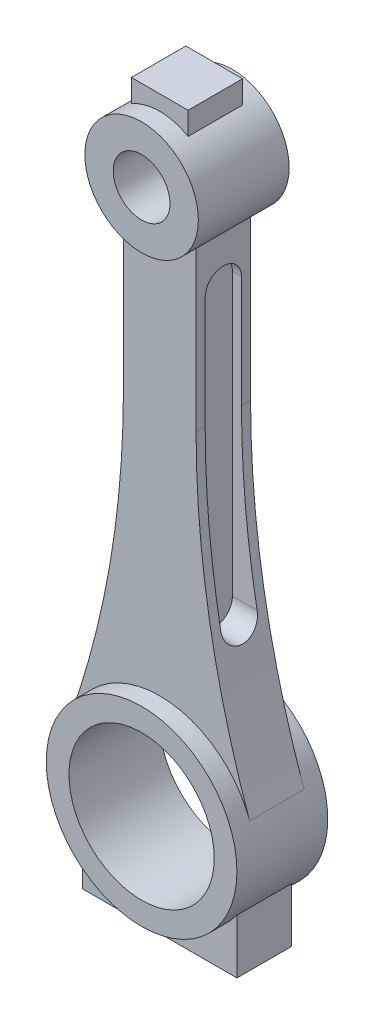
ISO-10303-21;
HEADER;
FILE_DESCRIPTION(('STEP AP214'),'2;1');
FILE_NAME('part.step','',(''),(''),'','','');
FILE_SCHEMA(('AUTOMOTIVE_DESIGN { 1 0 10303 214 1 1 1 1 }'));
ENDSEC;
DATA;
#1=APPLICATION_CONTEXT('core data for automotive mechanical design processes');
#2=APPLICATION_PROTOCOL_DEFINITION('international standard','automotive_design',2000,#1);
#3=PRODUCT_CONTEXT('',#1,'mechanical');
#4=PRODUCT('Part','Part','',(#3));
#5=PRODUCT_RELATED_PRODUCT_CATEGORY('part','',(#4));
#6=PRODUCT_DEFINITION_FORMATION('','',#4);
#7=PRODUCT_DEFINITION_CONTEXT('part definition',#1,'design');
#8=PRODUCT_DEFINITION('design','',#6,#7);
#9=PRODUCT_DEFINITION_SHAPE('','',#8);
#10=(LENGTH_UNIT() NAMED_UNIT(*) SI_UNIT(.MILLI.,.METRE.));
#11=(NAMED_UNIT(*) PLANE_ANGLE_UNIT() SI_UNIT($,.RADIAN.));
#12=(NAMED_UNIT(*) SI_UNIT($,.STERADIAN.) SOLID_ANGLE_UNIT());
#13=UNCERTAINTY_MEASURE_WITH_UNIT(LENGTH_MEASURE(1.E-05),#10,'distance_accuracy_value','');
#14=(GEOMETRIC_REPRESENTATION_CONTEXT(3) GLOBAL_UNCERTAINTY_ASSIGNED_CONTEXT((#13)) GLOBAL_UNIT_ASSIGNED_CONTEXT((#10,
#11,#12)) REPRESENTATION_CONTEXT('',''));
#15=CARTESIAN_POINT('',(0.,0.,0.));
#16=DIRECTION('',(0.,0.,1.));
#17=DIRECTION('',(1.,0.,0.));
#18=AXIS2_PLACEMENT_3D('',#15,#16,#17);
#19=CARTESIAN_POINT('',(212.132819979024,75.3953136438508,6.));
#20=DIRECTION('',(0.,0.,-1.));
#21=DIRECTION('',(-1.,0.,0.));
#22=AXIS2_PLACEMENT_3D('',#19,#20,#21);
#23=CYLINDRICAL_SURFACE('',#22,204.132819979024);
#24=CARTESIAN_POINT('',(11.4544735884215,38.,-4.00000000000001));
#25=CARTESIAN_POINT('',(11.4757515518411,37.8858086335559,-4.00000967356236));
#26=CARTESIAN_POINT('',(11.4971278489319,37.7716411229783,-3.9951101211208));
#27=CARTESIAN_POINT('',(11.5399210356049,37.544152772884,-3.97557755361704));
#28=CARTESIAN_POINT('',(11.5613379239584,37.4308319082382,-3.9609448286138));
#29=CARTESIAN_POINT('',(11.6040518019029,37.2058589467753,-3.92203609087538));
#30=CARTESIAN_POINT('',(11.6253488219802,37.0942064124742,-3.89776265395078));
#31=CARTESIAN_POINT('',(11.6676599337569,36.8733657612217,-3.83975872762631));
#32=CARTESIAN_POINT('',(11.6886740293759,36.7641776101131,-3.80602836938937));
#33=CARTESIAN_POINT('',(11.7510730473326,36.4413470108117,-3.69089420326938));
#34=CARTESIAN_POINT('',(11.7918289081029,36.2323636826891,-3.59553432969808));
#35=CARTESIAN_POINT('',(11.8702126062764,35.833491871712,-3.37027556179514));
#36=CARTESIAN_POINT('',(11.9078413597511,35.643597793309,-3.24038682968163));
#37=CARTESIAN_POINT('',(11.9784728244352,35.2894796680367,-2.950436910244));
#38=CARTESIAN_POINT('',(12.0115036519544,35.1250988255321,-2.79057453802655));
#39=CARTESIAN_POINT('',(12.0720036427705,34.8256035029566,-2.44449926104124));
#40=CARTESIAN_POINT('',(12.0994724370193,34.6904909648341,-2.25828460915734));
#41=CARTESIAN_POINT('',(12.1473413477104,34.4559602912754,-1.86832249559897));
#42=CARTESIAN_POINT('',(12.1678582991114,34.3559510460777,-1.66494499104501));
#43=CARTESIAN_POINT('',(12.201667760202,34.1915558050773,-1.24372237948288));
#44=CARTESIAN_POINT('',(12.2149615713728,34.1271633917176,-1.02587988675161));
#45=CARTESIAN_POINT('',(12.2336033492388,34.0369591960168,-0.586274812122711));
#46=CARTESIAN_POINT('',(12.2390950212481,34.0104496060439,-0.364661335561861));
#47=CARTESIAN_POINT('',(12.2423732155318,33.9946184843632,0.0799443502249359));
#48=CARTESIAN_POINT('',(12.2401601145853,34.0052951341723,0.302936491499029));
#49=CARTESIAN_POINT('',(12.2281765408432,34.0632127244266,0.741781925824308));
#50=CARTESIAN_POINT('',(12.2184766498272,34.1101121767816,0.957682365575695));
#51=CARTESIAN_POINT('',(12.1919895794175,34.2385791029979,1.37844153266757));
#52=CARTESIAN_POINT('',(12.1752023313576,34.3201469127454,1.58330015300714));
#53=CARTESIAN_POINT('',(12.1350793834177,34.5159552856904,1.977397761575));
#54=CARTESIAN_POINT('',(12.1117098081663,34.6303649264094,2.16654921549123));
#55=CARTESIAN_POINT('',(12.0593260749273,34.8882465100265,2.52297125984127));
#56=CARTESIAN_POINT('',(12.0303117725959,35.0317191961119,2.69024129055298));
#57=CARTESIAN_POINT('',(11.9671383735568,35.3461665633751,3.00114206510913));
#58=CARTESIAN_POINT('',(11.9329025496515,35.5175545383741,3.14433904981938));
#59=CARTESIAN_POINT('',(11.8607975408037,35.8812712267655,3.40006280722764));
#60=CARTESIAN_POINT('',(11.8229268395298,36.0736086840292,3.51257670427656));
#61=CARTESIAN_POINT('',(11.744011046999,36.4777513253325,3.70593438635491));
#62=CARTESIAN_POINT('',(11.7029182624971,36.6898643551292,3.78611370956408));
#63=CARTESIAN_POINT('',(11.6195357198389,37.1241795414682,3.90944320644274));
#64=CARTESIAN_POINT('',(11.5772477716993,37.3463667203578,3.95264656840454));
#65=CARTESIAN_POINT('',(11.5215540274852,37.6417241762258,3.98457340087694));
#66=CARTESIAN_POINT('',(11.5080944382148,37.713314753212,3.99036111817268));
#67=CARTESIAN_POINT('',(11.481236818834,37.8565916807733,3.99806924003837));
#68=CARTESIAN_POINT('',(11.4678387235409,37.9282776734255,3.99999606757804));
#69=CARTESIAN_POINT('',(11.4544735884215,38.,3.99999999999999));
#70=B_SPLINE_CURVE_WITH_KNOTS('',3,(#24,#25,#26,#27,#28,#29,#30,#31,#32,#33,#34,#35,#36,#37,#38,
#39,#40,#41,#42,#43,#44,#45,#46,#47,#48,#49,#50,#51,#52,#53,#54,#55,#56,#57,#58,#59,#60,#61,#62,
#63,#64,#65,#66,#67,#68,#69),.UNSPECIFIED.,.F.,.F.,(4,2,2,2,2,2,2,2,2,2,2,2,2,2,2,2,2,2,2,2,2,2,
4),(0.,0.348357600629769,0.696704820295746,1.044959030908,1.39320841164154,2.0894785742732,
2.78554404346983,3.47714614167072,4.16879411353829,4.84816302804555,5.52740949173435,
6.19397531687088,6.86050854603355,7.52083364695974,8.18116514562693,8.84495910470897,
9.508770040179,10.1834922182609,10.8584970981523,11.546741507572,12.2339942357505,
12.4531452672714,12.6719314158043),.UNSPECIFIED.);
#71=CARTESIAN_POINT('',(11.4544735884215,38.,-4.00000000000001));
#72=VERTEX_POINT('',#71);
#73=CARTESIAN_POINT('',(11.4544735884215,38.,3.99999999999999));
#74=VERTEX_POINT('',#73);
#75=EDGE_CURVE('E483',#72,#74,#70,.T.);
#76=ORIENTED_EDGE('',*,*,#75,.T.);
#77=CARTESIAN_POINT('',(212.132819979024,75.3953136438508,4.));
#78=DIRECTION('',(0.,0.,-1.));
#79=DIRECTION('',(0.,1.,0.));
#80=AXIS2_PLACEMENT_3D('',#77,#78,#79);
#81=CIRCLE('',#80,204.132819979024);
#82=CARTESIAN_POINT('',(8.00000000000001,75.3953136438507,4.));
#83=VERTEX_POINT('',#82);
#84=EDGE_CURVE('E280',#74,#83,#81,.T.);
#85=ORIENTED_EDGE('',*,*,#84,.T.);
#86=DIRECTION('',(0.,0.,-1.));
#87=VECTOR('',#86,1.);
#88=CARTESIAN_POINT('',(8.00000000000001,75.3953136438507,6.));
#89=LINE('',#88,#87);
#90=CARTESIAN_POINT('',(8.00000000000001,75.3953136438507,6.));
#91=VERTEX_POINT('',#90);
#92=EDGE_CURVE('E438',#91,#83,#89,.T.);
#93=ORIENTED_EDGE('',*,*,#92,.F.);
#94=CARTESIAN_POINT('',(212.132819979024,75.3953136438508,6.));
#95=DIRECTION('',(0.,0.,1.));
#96=DIRECTION('',(1.,0.,0.));
#97=AXIS2_PLACEMENT_3D('',#94,#95,#96);
#98=CIRCLE('',#97,204.132819979024);
#99=CARTESIAN_POINT('',(19.7873824881444,7.03274443356765,6.));
#100=VERTEX_POINT('',#99);
#101=EDGE_CURVE('E404',#91,#100,#98,.T.);
#102=ORIENTED_EDGE('',*,*,#101,.T.);
#103=DIRECTION('',(0.,0.,-1.));
#104=VECTOR('',#103,1.);
#105=CARTESIAN_POINT('',(19.7873824881444,7.03274443356765,6.));
#106=LINE('',#105,#104);
#107=CARTESIAN_POINT('',(19.7873824881444,7.03274443356765,-6.));
#108=VERTEX_POINT('',#107);
#109=EDGE_CURVE('E442',#100,#108,#106,.T.);
#110=ORIENTED_EDGE('',*,*,#109,.T.);
#111=CARTESIAN_POINT('',(212.132819979024,75.3953136438508,-6.));
#112=DIRECTION('',(0.,0.,1.));
#113=DIRECTION('',(1.,0.,0.));
#114=AXIS2_PLACEMENT_3D('',#111,#112,#113);
#115=CIRCLE('',#114,204.132819979024);
#116=CARTESIAN_POINT('',(8.00000000000001,75.3953136438507,-6.));
#117=VERTEX_POINT('',#116);
#118=EDGE_CURVE('E428',#117,#108,#115,.T.);
#119=ORIENTED_EDGE('',*,*,#118,.F.);
#120=CARTESIAN_POINT('',(8.00000000000001,75.3953136438507,-4.));
#121=VERTEX_POINT('',#120);
#122=EDGE_CURVE('E437',#121,#117,#89,.T.);
#123=ORIENTED_EDGE('',*,*,#122,.F.);
#124=CARTESIAN_POINT('',(212.132819979024,75.3953136438508,-4.));
#125=DIRECTION('',(0.,0.,1.));
#126=DIRECTION('',(0.,-1.,0.));
#127=AXIS2_PLACEMENT_3D('',#124,#125,#126);
#128=CIRCLE('',#127,204.132819979024);
#129=EDGE_CURVE('E69',#121,#72,#128,.T.);
#130=ORIENTED_EDGE('',*,*,#129,.T.);
#131=EDGE_LOOP('',(#76,#85,#93,#102,#110,#119,#123,#130));
#132=FACE_BOUND('',#131,.T.);
#133=ADVANCED_FACE('F45',(#132),#23,.F.);
#134=CARTESIAN_POINT('',(8.00000000000003,0.,6.));
#135=DIRECTION('',(-1.,0.,0.));
#136=DIRECTION('',(0.,-1.,0.));
#137=AXIS2_PLACEMENT_3D('',#134,#135,#136);
#138=PLANE('',#137);
#139=DIRECTION('',(0.,-1.,0.));
#140=VECTOR('',#139,1.);
#141=CARTESIAN_POINT('',(8.00000000000003,0.,3.99999999999999));
#142=LINE('',#141,#140);
#143=CARTESIAN_POINT('',(8.00000000000001,100.,4.));
#144=VERTEX_POINT('',#143);
#145=EDGE_CURVE('E480',#144,#83,#142,.T.);
#146=ORIENTED_EDGE('',*,*,#145,.F.);
#147=CARTESIAN_POINT('',(8.,100.,0.));
#148=DIRECTION('',(-1.,0.,0.));
#149=DIRECTION('',(0.,-1.,0.));
#150=AXIS2_PLACEMENT_3D('',#147,#148,#149);
#151=CIRCLE('',#150,4.);
#152=CARTESIAN_POINT('',(8.00000000000001,100.,-4.));
#153=VERTEX_POINT('',#152);
#154=EDGE_CURVE('E477',#153,#144,#151,.F.);
#155=ORIENTED_EDGE('',*,*,#154,.F.);
#156=DIRECTION('',(0.,1.,0.));
#157=VECTOR('',#156,1.);
#158=CARTESIAN_POINT('',(8.00000000000003,0.,-4.00000000000001));
#159=LINE('',#158,#157);
#160=EDGE_CURVE('E468',#121,#153,#159,.T.);
#161=ORIENTED_EDGE('',*,*,#160,.F.);
#162=ORIENTED_EDGE('',*,*,#122,.T.);
#163=DIRECTION('',(0.,1.,0.));
#164=VECTOR('',#163,1.);
#165=CARTESIAN_POINT('',(8.00000000000003,0.,-6.));
#166=LINE('',#165,#164);
#167=CARTESIAN_POINT('',(8.,110.395313643851,-6.));
#168=VERTEX_POINT('',#167);
#169=EDGE_CURVE('E393',#117,#168,#166,.T.);
#170=ORIENTED_EDGE('',*,*,#169,.T.);
#171=DIRECTION('',(0.,0.,-1.));
#172=VECTOR('',#171,1.);
#173=CARTESIAN_POINT('',(8.,110.395313643851,6.));
#174=LINE('',#173,#172);
#175=CARTESIAN_POINT('',(8.,110.395313643851,6.));
#176=VERTEX_POINT('',#175);
#177=EDGE_CURVE('E412',#176,#168,#174,.T.);
#178=ORIENTED_EDGE('',*,*,#177,.F.);
#179=DIRECTION('',(0.,1.,0.));
#180=VECTOR('',#179,1.);
#181=CARTESIAN_POINT('',(8.00000000000003,0.,6.));
#182=LINE('',#181,#180);
#183=EDGE_CURVE('E408',#91,#176,#182,.T.);
#184=ORIENTED_EDGE('',*,*,#183,.F.);
#185=ORIENTED_EDGE('',*,*,#92,.T.);
#186=EDGE_LOOP('',(#146,#155,#161,#162,#170,#178,#184,#185));
#187=FACE_BOUND('',#186,.T.);
#188=ADVANCED_FACE('F578',(#187),#138,.F.);
#189=CARTESIAN_POINT('',(0.,120.,10.));
#190=DIRECTION('',(0.,0.,-1.));
#191=DIRECTION('',(-1.,0.,0.));
#192=AXIS2_PLACEMENT_3D('',#189,#190,#191);
#193=CYLINDRICAL_SURFACE('',#192,6.25);
#194=CARTESIAN_POINT('',(0.,120.,10.));
#195=DIRECTION('',(0.,0.,1.));
#196=DIRECTION('',(1.,0.,0.));
#197=AXIS2_PLACEMENT_3D('',#194,#195,#196);
#198=CIRCLE('',#197,6.25);
#199=CARTESIAN_POINT('',(6.25,120.,10.));
#200=VERTEX_POINT('',#199);
#201=EDGE_CURVE('E459',#200,#200,#198,.T.);
#202=ORIENTED_EDGE('',*,*,#201,.T.);
#203=EDGE_LOOP('',(#202));
#204=FACE_BOUND('',#203,.T.);
#205=CARTESIAN_POINT('',(0.,120.,-10.));
#206=DIRECTION('',(0.,0.,1.));
#207=DIRECTION('',(1.,0.,0.));
#208=AXIS2_PLACEMENT_3D('',#205,#206,#207);
#209=CIRCLE('',#208,6.25);
#210=CARTESIAN_POINT('',(6.25,120.,-10.));
#211=VERTEX_POINT('',#210);
#212=EDGE_CURVE('E458',#211,#211,#209,.T.);
#213=ORIENTED_EDGE('',*,*,#212,.F.);
#214=EDGE_LOOP('',(#213));
#215=FACE_BOUND('',#214,.T.);
#216=ADVANCED_FACE('F47',(#204,#215),#193,.F.);
#217=CARTESIAN_POINT('',(0.,120.,10.));
#218=DIRECTION('',(0.,0.,-1.));
#219=DIRECTION('',(-1.,0.,0.));
#220=AXIS2_PLACEMENT_3D('',#217,#218,#219);
#221=CYLINDRICAL_SURFACE('',#220,12.5);
#222=DIRECTION('',(0.,0.,-1.));
#223=VECTOR('',#222,1.);
#224=CARTESIAN_POINT('',(6.25,130.825317547305,6.));
#225=LINE('',#224,#223);
#226=CARTESIAN_POINT('',(6.25,130.825317547305,6.));
#227=VERTEX_POINT('',#226);
#228=CARTESIAN_POINT('',(6.25,130.825317547305,-6.));
#229=VERTEX_POINT('',#228);
#230=EDGE_CURVE('E361',#227,#229,#225,.T.);
#231=ORIENTED_EDGE('',*,*,#230,.F.);
#232=CARTESIAN_POINT('',(0.,120.,6.));
#233=DIRECTION('',(0.,0.,1.));
#234=DIRECTION('',(1.,0.,0.));
#235=AXIS2_PLACEMENT_3D('',#232,#233,#234);
#236=CIRCLE('',#235,12.5);
#237=CARTESIAN_POINT('',(-6.25,130.825317547305,6.));
#238=VERTEX_POINT('',#237);
#239=EDGE_CURVE('E337',#227,#238,#236,.T.);
#240=ORIENTED_EDGE('',*,*,#239,.T.);
#241=DIRECTION('',(0.,0.,-1.));
#242=VECTOR('',#241,1.);
#243=CARTESIAN_POINT('',(-6.25,130.825317547305,6.));
#244=LINE('',#243,#242);
#245=CARTESIAN_POINT('',(-6.25,130.825317547305,-6.));
#246=VERTEX_POINT('',#245);
#247=EDGE_CURVE('E365',#238,#246,#244,.T.);
#248=ORIENTED_EDGE('',*,*,#247,.T.);
#249=CARTESIAN_POINT('',(0.,120.,-6.));
#250=DIRECTION('',(0.,0.,1.));
#251=DIRECTION('',(1.,0.,0.));
#252=AXIS2_PLACEMENT_3D('',#249,#250,#251);
#253=CIRCLE('',#252,12.5);
#254=EDGE_CURVE('E352',#229,#246,#253,.T.);
#255=ORIENTED_EDGE('',*,*,#254,.F.);
#256=EDGE_LOOP('',(#231,#240,#248,#255));
#257=FACE_BOUND('',#256,.T.);
#258=DIRECTION('',(0.,0.,-1.));
#259=VECTOR('',#258,1.);
#260=CARTESIAN_POINT('',(-7.99999999999999,110.395313643851,6.));
#261=LINE('',#260,#259);
#262=CARTESIAN_POINT('',(-7.99999999999999,110.395313643851,6.));
#263=VERTEX_POINT('',#262);
#264=CARTESIAN_POINT('',(-7.99999999999999,110.395313643851,-6.));
#265=VERTEX_POINT('',#264);
#266=EDGE_CURVE('E454',#263,#265,#261,.T.);
#267=ORIENTED_EDGE('',*,*,#266,.F.);
#268=CARTESIAN_POINT('',(0.,120.,6.));
#269=DIRECTION('',(0.,0.,1.));
#270=DIRECTION('',(1.,0.,0.));
#271=AXIS2_PLACEMENT_3D('',#268,#269,#270);
#272=CIRCLE('',#271,12.5);
#273=EDGE_CURVE('E389',#263,#176,#272,.T.);
#274=ORIENTED_EDGE('',*,*,#273,.T.);
#275=ORIENTED_EDGE('',*,*,#177,.T.);
#276=CARTESIAN_POINT('',(0.,120.,-6.));
#277=DIRECTION('',(0.,0.,1.));
#278=DIRECTION('',(1.,0.,0.));
#279=AXIS2_PLACEMENT_3D('',#276,#277,#278);
#280=CIRCLE('',#279,12.5);
#281=EDGE_CURVE('E382',#265,#168,#280,.T.);
#282=ORIENTED_EDGE('',*,*,#281,.F.);
#283=EDGE_LOOP('',(#267,#274,#275,#282));
#284=FACE_BOUND('',#283,.T.);
#285=CARTESIAN_POINT('',(0.,120.,10.));
#286=DIRECTION('',(0.,0.,1.));
#287=DIRECTION('',(1.,0.,0.));
#288=AXIS2_PLACEMENT_3D('',#285,#286,#287);
#289=CIRCLE('',#288,12.5);
#290=CARTESIAN_POINT('',(12.5,120.,10.));
#291=VERTEX_POINT('',#290);
#292=EDGE_CURVE('E463',#291,#291,#289,.T.);
#293=ORIENTED_EDGE('',*,*,#292,.F.);
#294=EDGE_LOOP('',(#293));
#295=FACE_BOUND('',#294,.T.);
#296=CARTESIAN_POINT('',(0.,120.,-10.));
#297=DIRECTION('',(0.,0.,1.));
#298=DIRECTION('',(1.,0.,0.));
#299=AXIS2_PLACEMENT_3D('',#296,#297,#298);
#300=CIRCLE('',#299,12.5);
#301=CARTESIAN_POINT('',(12.5,120.,-10.));
#302=VERTEX_POINT('',#301);
#303=EDGE_CURVE('E464',#302,#302,#300,.T.);
#304=ORIENTED_EDGE('',*,*,#303,.T.);
#305=EDGE_LOOP('',(#304));
#306=FACE_BOUND('',#305,.T.);
#307=ADVANCED_FACE('F585',(#257,#284,#295,#306),#221,.T.);
#308=CARTESIAN_POINT('',(0.,0.,10.));
#309=DIRECTION('',(0.,0.,1.));
#310=DIRECTION('',(1.,0.,0.));
#311=AXIS2_PLACEMENT_3D('',#308,#309,#310);
#312=PLANE('',#311);
#313=ORIENTED_EDGE('',*,*,#201,.F.);
#314=EDGE_LOOP('',(#313));
#315=FACE_BOUND('',#314,.T.);
#316=ORIENTED_EDGE('',*,*,#292,.T.);
#317=EDGE_LOOP('',(#316));
#318=FACE_BOUND('',#317,.T.);
#319=ADVANCED_FACE('F633',(#315,#318),#312,.T.);
#320=CARTESIAN_POINT('',(0.,0.,-10.));
#321=DIRECTION('',(0.,0.,1.));
#322=DIRECTION('',(1.,0.,0.));
#323=AXIS2_PLACEMENT_3D('',#320,#321,#322);
#324=PLANE('',#323);
#325=ORIENTED_EDGE('',*,*,#212,.T.);
#326=EDGE_LOOP('',(#325));
#327=FACE_BOUND('',#326,.T.);
#328=ORIENTED_EDGE('',*,*,#303,.F.);
#329=EDGE_LOOP('',(#328));
#330=FACE_BOUND('',#329,.T.);
#331=ADVANCED_FACE('F631',(#327,#330),#324,.F.);
#332=CARTESIAN_POINT('',(-8.,0.,6.));
#333=DIRECTION('',(-1.,0.,0.));
#334=DIRECTION('',(0.,-1.,0.));
#335=AXIS2_PLACEMENT_3D('',#332,#333,#334);
#336=PLANE('',#335);
#337=DIRECTION('',(0.,-1.,0.));
#338=VECTOR('',#337,1.);
#339=CARTESIAN_POINT('',(-8.,0.,-4.00000000000001));
#340=LINE('',#339,#338);
#341=CARTESIAN_POINT('',(-7.99999999999999,100.,-4.));
#342=VERTEX_POINT('',#341);
#343=CARTESIAN_POINT('',(-7.99999999999995,75.3953136438507,-4.));
#344=VERTEX_POINT('',#343);
#345=EDGE_CURVE('E247',#342,#344,#340,.T.);
#346=ORIENTED_EDGE('',*,*,#345,.F.);
#347=CARTESIAN_POINT('',(-7.99999999999999,100.,0.));
#348=DIRECTION('',(-1.,0.,0.));
#349=DIRECTION('',(0.,-1.,0.));
#350=AXIS2_PLACEMENT_3D('',#347,#348,#349);
#351=CIRCLE('',#350,4.);
#352=CARTESIAN_POINT('',(-7.99999999999999,100.,4.));
#353=VERTEX_POINT('',#352);
#354=EDGE_CURVE('E11',#353,#342,#351,.T.);
#355=ORIENTED_EDGE('',*,*,#354,.F.);
#356=DIRECTION('',(0.,1.,0.));
#357=VECTOR('',#356,1.);
#358=CARTESIAN_POINT('',(-8.,0.,3.99999999999999));
#359=LINE('',#358,#357);
#360=CARTESIAN_POINT('',(-7.99999999999995,75.3953136438507,4.));
#361=VERTEX_POINT('',#360);
#362=EDGE_CURVE('E210',#361,#353,#359,.T.);
#363=ORIENTED_EDGE('',*,*,#362,.F.);
#364=DIRECTION('',(0.,0.,-1.));
#365=VECTOR('',#364,1.);
#366=CARTESIAN_POINT('',(-7.99999999999999,75.3953136438507,6.));
#367=LINE('',#366,#365);
#368=CARTESIAN_POINT('',(-7.99999999999999,75.3953136438507,6.));
#369=VERTEX_POINT('',#368);
#370=EDGE_CURVE('E450',#369,#361,#367,.T.);
#371=ORIENTED_EDGE('',*,*,#370,.F.);
#372=DIRECTION('',(0.,1.,0.));
#373=VECTOR('',#372,1.);
#374=CARTESIAN_POINT('',(-8.,0.,6.));
#375=LINE('',#374,#373);
#376=EDGE_CURVE('E392',#369,#263,#375,.T.);
#377=ORIENTED_EDGE('',*,*,#376,.T.);
#378=ORIENTED_EDGE('',*,*,#266,.T.);
#379=DIRECTION('',(0.,1.,0.));
#380=VECTOR('',#379,1.);
#381=CARTESIAN_POINT('',(-8.,0.,-6.));
#382=LINE('',#381,#380);
#383=CARTESIAN_POINT('',(-7.99999999999999,75.3953136438507,-6.));
#384=VERTEX_POINT('',#383);
#385=EDGE_CURVE('E416',#384,#265,#382,.T.);
#386=ORIENTED_EDGE('',*,*,#385,.F.);
#387=EDGE_CURVE('E449',#344,#384,#367,.T.);
#388=ORIENTED_EDGE('',*,*,#387,.F.);
#389=EDGE_LOOP('',(#346,#355,#363,#371,#377,#378,#386,#388));
#390=FACE_BOUND('',#389,.T.);
#391=ADVANCED_FACE('F627',(#390),#336,.T.);
#392=CARTESIAN_POINT('',(-212.132819979024,75.3953136438507,6.));
#393=DIRECTION('',(0.,0.,-1.));
#394=DIRECTION('',(-1.,0.,0.));
#395=AXIS2_PLACEMENT_3D('',#392,#393,#394);
#396=CYLINDRICAL_SURFACE('',#395,204.132819979024);
#397=CARTESIAN_POINT('',(-11.4544735884215,38.,3.99999999999999));
#398=CARTESIAN_POINT('',(-11.4757515518411,37.8858086335559,4.00000967356234));
#399=CARTESIAN_POINT('',(-11.497127848932,37.7716411229782,3.99511012112078));
#400=CARTESIAN_POINT('',(-11.5399210356049,37.544152772884,3.97557755361703));
#401=CARTESIAN_POINT('',(-11.5613379239584,37.4308319082382,3.96094482861378));
#402=CARTESIAN_POINT('',(-11.6040518019029,37.2058589467753,3.92203609087537));
#403=CARTESIAN_POINT('',(-11.6253488219802,37.0942064124742,3.89776265395076));
#404=CARTESIAN_POINT('',(-11.6676599337569,36.8733657612217,3.83975872762629));
#405=CARTESIAN_POINT('',(-11.6886740293759,36.7641776101131,3.80602836938935));
#406=CARTESIAN_POINT('',(-11.7510730473326,36.4413470108117,3.69089420326937));
#407=CARTESIAN_POINT('',(-11.7918289081029,36.2323636826891,3.59553432969806));
#408=CARTESIAN_POINT('',(-11.8702126062764,35.833491871712,3.37027556179512));
#409=CARTESIAN_POINT('',(-11.9078413597511,35.643597793309,3.24038682968162));
#410=CARTESIAN_POINT('',(-11.9784728244352,35.2894796680367,2.95043691024399));
#411=CARTESIAN_POINT('',(-12.0115036519544,35.1250988255321,2.79057453802654));
#412=CARTESIAN_POINT('',(-12.0720036427705,34.8256035029566,2.44449926104123));
#413=CARTESIAN_POINT('',(-12.0994724370193,34.6904909648341,2.25828460915732));
#414=CARTESIAN_POINT('',(-12.1473413477104,34.4559602912754,1.86832249559895));
#415=CARTESIAN_POINT('',(-12.1678582991115,34.3559510460777,1.66494499104499));
#416=CARTESIAN_POINT('',(-12.201667760202,34.1915558050773,1.24372237948286));
#417=CARTESIAN_POINT('',(-12.2149615713728,34.1271633917176,1.02587988675159));
#418=CARTESIAN_POINT('',(-12.2336033492387,34.0369591960168,0.586274812122686));
#419=CARTESIAN_POINT('',(-12.2390950212481,34.0104496060439,0.364661335561837));
#420=CARTESIAN_POINT('',(-12.2423732155318,33.9946184843632,-0.0799443502249581));
#421=CARTESIAN_POINT('',(-12.2401601145852,34.0052951341723,-0.302936491499051));
#422=CARTESIAN_POINT('',(-12.2281765408432,34.0632127244266,-0.741781925824331));
#423=CARTESIAN_POINT('',(-12.2184766498272,34.1101121767816,-0.957682365575719));
#424=CARTESIAN_POINT('',(-12.1919895794175,34.2385791029979,-1.3784415326676));
#425=CARTESIAN_POINT('',(-12.1752023313576,34.3201469127454,-1.58330015300716));
#426=CARTESIAN_POINT('',(-12.1350793834177,34.5159552856904,-1.97739776157502));
#427=CARTESIAN_POINT('',(-12.1117098081663,34.6303649264094,-2.16654921549125));
#428=CARTESIAN_POINT('',(-12.0593260749272,34.8882465100265,-2.52297125984129));
#429=CARTESIAN_POINT('',(-12.0303117725959,35.0317191961119,-2.690241290553));
#430=CARTESIAN_POINT('',(-11.9671383735568,35.3461665633751,-3.00114206510916));
#431=CARTESIAN_POINT('',(-11.9329025496514,35.5175545383741,-3.1443390498194));
#432=CARTESIAN_POINT('',(-11.8607975408037,35.8812712267655,-3.40006280722766));
#433=CARTESIAN_POINT('',(-11.8229268395298,36.0736086840292,-3.51257670427658));
#434=CARTESIAN_POINT('',(-11.744011046999,36.4777513253325,-3.70593438635493));
#435=CARTESIAN_POINT('',(-11.7029182624971,36.6898643551292,-3.78611370956409));
#436=CARTESIAN_POINT('',(-11.6195357198389,37.1241795414682,-3.90944320644275));
#437=CARTESIAN_POINT('',(-11.5772477716992,37.3463667203578,-3.95264656840456));
#438=CARTESIAN_POINT('',(-11.5215540274852,37.6417241762258,-3.98457340087695));
#439=CARTESIAN_POINT('',(-11.5080944382148,37.713314753212,-3.9903611181727));
#440=CARTESIAN_POINT('',(-11.4812368188341,37.8565916807734,-3.99806924003838));
#441=CARTESIAN_POINT('',(-11.4678387235409,37.9282776734255,-3.99999606757806));
#442=CARTESIAN_POINT('',(-11.4544735884214,38.,-4.00000000000001));
#443=B_SPLINE_CURVE_WITH_KNOTS('',3,(#397,#398,#399,#400,#401,#402,#403,#404,#405,#406,#407,
#408,#409,#410,#411,#412,#413,#414,#415,#416,#417,#418,#419,#420,#421,#422,#423,#424,#425,#426,
#427,#428,#429,#430,#431,#432,#433,#434,#435,#436,#437,#438,#439,#440,#441,#442),.UNSPECIFIED.,
.F.,.F.,(4,2,2,2,2,2,2,2,2,2,2,2,2,2,2,2,2,2,2,2,2,2,4),(0.,0.348357600629778,0.696704820295753,
1.044959030908,1.39320841164154,2.0894785742732,2.78554404346983,3.47714614167072,
4.1687941135383,4.84816302804556,5.52740949173436,6.19397531687089,6.86050854603355,
7.52083364695975,8.18116514562693,8.84495910470897,9.50877004017901,10.1834922182609,
10.8584970981523,11.546741507572,12.2339942357505,12.4531452672714,12.6719314158043),.UNSPECIFIED.);
#444=CARTESIAN_POINT('',(-11.4544735884215,38.,3.99999999999999));
#445=VERTEX_POINT('',#444);
#446=CARTESIAN_POINT('',(-11.4544735884215,38.,-4.00000000000001));
#447=VERTEX_POINT('',#446);
#448=EDGE_CURVE('E617',#445,#447,#443,.T.);
#449=ORIENTED_EDGE('',*,*,#448,.T.);
#450=CARTESIAN_POINT('',(-212.132819979024,75.3953136438507,-4.));
#451=DIRECTION('',(0.,0.,-1.));
#452=DIRECTION('',(0.,1.,0.));
#453=AXIS2_PLACEMENT_3D('',#450,#451,#452);
#454=CIRCLE('',#453,204.132819979024);
#455=EDGE_CURVE('E54',#447,#344,#454,.F.);
#456=ORIENTED_EDGE('',*,*,#455,.T.);
#457=ORIENTED_EDGE('',*,*,#387,.T.);
#458=CARTESIAN_POINT('',(-212.132819979024,75.3953136438507,-6.));
#459=DIRECTION('',(0.,0.,1.));
#460=DIRECTION('',(1.,0.,0.));
#461=AXIS2_PLACEMENT_3D('',#458,#459,#460);
#462=CIRCLE('',#461,204.132819979024);
#463=CARTESIAN_POINT('',(-19.7873824881444,7.03274443356764,-6.));
#464=VERTEX_POINT('',#463);
#465=EDGE_CURVE('E420',#384,#464,#462,.F.);
#466=ORIENTED_EDGE('',*,*,#465,.T.);
#467=DIRECTION('',(0.,0.,-1.));
#468=VECTOR('',#467,1.);
#469=CARTESIAN_POINT('',(-19.7873824881444,7.03274443356764,6.));
#470=LINE('',#469,#468);
#471=CARTESIAN_POINT('',(-19.7873824881444,7.03274443356764,6.));
#472=VERTEX_POINT('',#471);
#473=EDGE_CURVE('E446',#472,#464,#470,.T.);
#474=ORIENTED_EDGE('',*,*,#473,.F.);
#475=CARTESIAN_POINT('',(-212.132819979024,75.3953136438507,6.));
#476=DIRECTION('',(0.,0.,1.));
#477=DIRECTION('',(1.,0.,0.));
#478=AXIS2_PLACEMENT_3D('',#475,#476,#477);
#479=CIRCLE('',#478,204.132819979024);
#480=EDGE_CURVE('E397',#369,#472,#479,.F.);
#481=ORIENTED_EDGE('',*,*,#480,.F.);
#482=ORIENTED_EDGE('',*,*,#370,.T.);
#483=CARTESIAN_POINT('',(-212.132819979024,75.3953136438507,4.));
#484=DIRECTION('',(0.,0.,1.));
#485=DIRECTION('',(0.,-1.,0.));
#486=AXIS2_PLACEMENT_3D('',#483,#484,#485);
#487=CIRCLE('',#486,204.132819979024);
#488=EDGE_CURVE('E493',#361,#445,#487,.F.);
#489=ORIENTED_EDGE('',*,*,#488,.T.);
#490=EDGE_LOOP('',(#449,#456,#457,#466,#474,#481,#482,#489));
#491=FACE_BOUND('',#490,.T.);
#492=ADVANCED_FACE('F574',(#491),#396,.F.);
#493=CARTESIAN_POINT('',(0.,0.,6.));
#494=DIRECTION('',(0.,0.,1.));
#495=DIRECTION('',(1.,0.,0.));
#496=AXIS2_PLACEMENT_3D('',#493,#494,#495);
#497=PLANE('',#496);
#498=ORIENTED_EDGE('',*,*,#273,.F.);
#499=ORIENTED_EDGE('',*,*,#376,.F.);
#500=ORIENTED_EDGE('',*,*,#480,.T.);
#501=CARTESIAN_POINT('',(0.,0.,6.));
#502=DIRECTION('',(0.,0.,1.));
#503=DIRECTION('',(1.,0.,0.));
#504=AXIS2_PLACEMENT_3D('',#501,#502,#503);
#505=CIRCLE('',#504,21.);
#506=EDGE_CURVE('E401',#100,#472,#505,.T.);
#507=ORIENTED_EDGE('',*,*,#506,.F.);
#508=ORIENTED_EDGE('',*,*,#101,.F.);
#509=ORIENTED_EDGE('',*,*,#183,.T.);
#510=EDGE_LOOP('',(#498,#499,#500,#507,#508,#509));
#511=FACE_BOUND('',#510,.T.);
#512=ADVANCED_FACE('F571',(#511),#497,.T.);
#513=CARTESIAN_POINT('',(0.,0.,-6.));
#514=DIRECTION('',(0.,0.,1.));
#515=DIRECTION('',(1.,0.,0.));
#516=AXIS2_PLACEMENT_3D('',#513,#514,#515);
#517=PLANE('',#516);
#518=ORIENTED_EDGE('',*,*,#281,.T.);
#519=ORIENTED_EDGE('',*,*,#169,.F.);
#520=ORIENTED_EDGE('',*,*,#118,.T.);
#521=CARTESIAN_POINT('',(0.,0.,-6.));
#522=DIRECTION('',(0.,0.,1.));
#523=DIRECTION('',(1.,0.,0.));
#524=AXIS2_PLACEMENT_3D('',#521,#522,#523);
#525=CIRCLE('',#524,21.);
#526=EDGE_CURVE('E424',#108,#464,#525,.T.);
#527=ORIENTED_EDGE('',*,*,#526,.T.);
#528=ORIENTED_EDGE('',*,*,#465,.F.);
#529=ORIENTED_EDGE('',*,*,#385,.T.);
#530=EDGE_LOOP('',(#518,#519,#520,#527,#528,#529));
#531=FACE_BOUND('',#530,.T.);
#532=ADVANCED_FACE('F569',(#531),#517,.F.);
#533=CARTESIAN_POINT('',(0.,0.,10.));
#534=DIRECTION('',(0.,0.,-1.));
#535=DIRECTION('',(-1.,0.,0.));
#536=AXIS2_PLACEMENT_3D('',#533,#534,#535);
#537=CYLINDRICAL_SURFACE('',#536,16.);
#538=CARTESIAN_POINT('',(0.,0.,10.));
#539=DIRECTION('',(0.,0.,1.));
#540=DIRECTION('',(1.,0.,0.));
#541=AXIS2_PLACEMENT_3D('',#538,#539,#540);
#542=CIRCLE('',#541,16.);
#543=CARTESIAN_POINT('',(16.,0.,10.));
#544=VERTEX_POINT('',#543);
#545=EDGE_CURVE('E373',#544,#544,#542,.T.);
#546=ORIENTED_EDGE('',*,*,#545,.T.);
#547=EDGE_LOOP('',(#546));
#548=FACE_BOUND('',#547,.T.);
#549=CARTESIAN_POINT('',(0.,0.,-10.));
#550=DIRECTION('',(0.,0.,1.));
#551=DIRECTION('',(1.,0.,0.));
#552=AXIS2_PLACEMENT_3D('',#549,#550,#551);
#553=CIRCLE('',#552,16.);
#554=CARTESIAN_POINT('',(16.,0.,-10.));
#555=VERTEX_POINT('',#554);
#556=EDGE_CURVE('E372',#555,#555,#553,.T.);
#557=ORIENTED_EDGE('',*,*,#556,.F.);
#558=EDGE_LOOP('',(#557));
#559=FACE_BOUND('',#558,.T.);
#560=ADVANCED_FACE('F565',(#548,#559),#537,.F.);
#561=CARTESIAN_POINT('',(0.,0.,10.));
#562=DIRECTION('',(0.,0.,-1.));
#563=DIRECTION('',(-1.,0.,0.));
#564=AXIS2_PLACEMENT_3D('',#561,#562,#563);
#565=CYLINDRICAL_SURFACE('',#564,21.);
#566=DIRECTION('',(0.,0.,-1.));
#567=VECTOR('',#566,1.);
#568=CARTESIAN_POINT('',(-17.,-12.328828005938,6.));
#569=LINE('',#568,#567);
#570=CARTESIAN_POINT('',(-17.,-12.328828005938,6.));
#571=VERTEX_POINT('',#570);
#572=CARTESIAN_POINT('',(-17.,-12.328828005938,-6.));
#573=VERTEX_POINT('',#572);
#574=EDGE_CURVE('E323',#571,#573,#569,.T.);
#575=ORIENTED_EDGE('',*,*,#574,.F.);
#576=CARTESIAN_POINT('',(0.,0.,6.));
#577=DIRECTION('',(0.,0.,1.));
#578=DIRECTION('',(1.,0.,0.));
#579=AXIS2_PLACEMENT_3D('',#576,#577,#578);
#580=CIRCLE('',#579,21.);
#581=CARTESIAN_POINT('',(17.,-12.3288280059379,6.));
#582=VERTEX_POINT('',#581);
#583=EDGE_CURVE('E285',#571,#582,#580,.T.);
#584=ORIENTED_EDGE('',*,*,#583,.T.);
#585=DIRECTION('',(0.,0.,-1.));
#586=VECTOR('',#585,1.);
#587=CARTESIAN_POINT('',(17.,-12.328828005938,6.));
#588=LINE('',#587,#586);
#589=CARTESIAN_POINT('',(17.,-12.328828005938,-6.));
#590=VERTEX_POINT('',#589);
#591=EDGE_CURVE('E300',#582,#590,#588,.T.);
#592=ORIENTED_EDGE('',*,*,#591,.T.);
#593=CARTESIAN_POINT('',(0.,0.,-6.));
#594=DIRECTION('',(0.,0.,1.));
#595=DIRECTION('',(1.,0.,0.));
#596=AXIS2_PLACEMENT_3D('',#593,#594,#595);
#597=CIRCLE('',#596,21.);
#598=EDGE_CURVE('E284',#573,#590,#597,.T.);
#599=ORIENTED_EDGE('',*,*,#598,.F.);
#600=EDGE_LOOP('',(#575,#584,#592,#599));
#601=FACE_BOUND('',#600,.T.);
#602=ORIENTED_EDGE('',*,*,#506,.T.);
#603=ORIENTED_EDGE('',*,*,#473,.T.);
#604=ORIENTED_EDGE('',*,*,#526,.F.);
#605=ORIENTED_EDGE('',*,*,#109,.F.);
#606=EDGE_LOOP('',(#602,#603,#604,#605));
#607=FACE_BOUND('',#606,.T.);
#608=CARTESIAN_POINT('',(0.,0.,10.));
#609=DIRECTION('',(0.,0.,1.));
#610=DIRECTION('',(1.,0.,0.));
#611=AXIS2_PLACEMENT_3D('',#608,#609,#610);
#612=CIRCLE('',#611,21.);
#613=CARTESIAN_POINT('',(21.,0.,10.));
#614=VERTEX_POINT('',#613);
#615=EDGE_CURVE('E377',#614,#614,#612,.T.);
#616=ORIENTED_EDGE('',*,*,#615,.F.);
#617=EDGE_LOOP('',(#616));
#618=FACE_BOUND('',#617,.T.);
#619=CARTESIAN_POINT('',(0.,0.,-10.));
#620=DIRECTION('',(0.,0.,1.));
#621=DIRECTION('',(1.,0.,0.));
#622=AXIS2_PLACEMENT_3D('',#619,#620,#621);
#623=CIRCLE('',#622,21.);
#624=CARTESIAN_POINT('',(21.,0.,-10.));
#625=VERTEX_POINT('',#624);
#626=EDGE_CURVE('E378',#625,#625,#623,.T.);
#627=ORIENTED_EDGE('',*,*,#626,.T.);
#628=EDGE_LOOP('',(#627));
#629=FACE_BOUND('',#628,.T.);
#630=ADVANCED_FACE('F558',(#601,#607,#618,#629),#565,.T.);
#631=CARTESIAN_POINT('',(0.,0.,10.));
#632=DIRECTION('',(0.,0.,1.));
#633=DIRECTION('',(1.,0.,0.));
#634=AXIS2_PLACEMENT_3D('',#631,#632,#633);
#635=PLANE('',#634);
#636=ORIENTED_EDGE('',*,*,#545,.F.);
#637=EDGE_LOOP('',(#636));
#638=FACE_BOUND('',#637,.T.);
#639=ORIENTED_EDGE('',*,*,#615,.T.);
#640=EDGE_LOOP('',(#639));
#641=FACE_BOUND('',#640,.T.);
#642=ADVANCED_FACE('F555',(#638,#641),#635,.T.);
#643=CARTESIAN_POINT('',(0.,0.,-10.));
#644=DIRECTION('',(0.,0.,1.));
#645=DIRECTION('',(1.,0.,0.));
#646=AXIS2_PLACEMENT_3D('',#643,#644,#645);
#647=PLANE('',#646);
#648=ORIENTED_EDGE('',*,*,#556,.T.);
#649=EDGE_LOOP('',(#648));
#650=FACE_BOUND('',#649,.T.);
#651=ORIENTED_EDGE('',*,*,#626,.F.);
#652=EDGE_LOOP('',(#651));
#653=FACE_BOUND('',#652,.T.);
#654=ADVANCED_FACE('F553',(#650,#653),#647,.F.);
#655=CARTESIAN_POINT('',(0.,135.825317547305,6.));
#656=DIRECTION('',(0.,-1.,0.));
#657=DIRECTION('',(0.,0.,-1.));
#658=AXIS2_PLACEMENT_3D('',#655,#656,#657);
#659=PLANE('',#658);
#660=DIRECTION('',(-1.,0.,0.));
#661=VECTOR('',#660,1.);
#662=CARTESIAN_POINT('',(0.,135.825317547305,-6.));
#663=LINE('',#662,#661);
#664=CARTESIAN_POINT('',(6.25,135.825317547305,-6.));
#665=VERTEX_POINT('',#664);
#666=CARTESIAN_POINT('',(-6.25,135.825317547305,-6.));
#667=VERTEX_POINT('',#666);
#668=EDGE_CURVE('E327',#665,#667,#663,.T.);
#669=ORIENTED_EDGE('',*,*,#668,.T.);
#670=DIRECTION('',(0.,0.,-1.));
#671=VECTOR('',#670,1.);
#672=CARTESIAN_POINT('',(-6.25,135.825317547305,6.));
#673=LINE('',#672,#671);
#674=CARTESIAN_POINT('',(-6.25,135.825317547305,6.));
#675=VERTEX_POINT('',#674);
#676=EDGE_CURVE('E368',#675,#667,#673,.T.);
#677=ORIENTED_EDGE('',*,*,#676,.F.);
#678=DIRECTION('',(-1.,0.,0.));
#679=VECTOR('',#678,1.);
#680=CARTESIAN_POINT('',(0.,135.825317547305,6.));
#681=LINE('',#680,#679);
#682=CARTESIAN_POINT('',(6.25,135.825317547305,6.));
#683=VERTEX_POINT('',#682);
#684=EDGE_CURVE('E328',#683,#675,#681,.T.);
#685=ORIENTED_EDGE('',*,*,#684,.F.);
#686=DIRECTION('',(0.,0.,-1.));
#687=VECTOR('',#686,1.);
#688=CARTESIAN_POINT('',(6.25,135.825317547305,6.));
#689=LINE('',#688,#687);
#690=EDGE_CURVE('E344',#683,#665,#689,.T.);
#691=ORIENTED_EDGE('',*,*,#690,.T.);
#692=EDGE_LOOP('',(#669,#677,#685,#691));
#693=FACE_BOUND('',#692,.T.);
#694=ADVANCED_FACE('F549',(#693),#659,.F.);
#695=CARTESIAN_POINT('',(-6.25,0.,6.));
#696=DIRECTION('',(1.,0.,0.));
#697=DIRECTION('',(0.,0.,-1.));
#698=AXIS2_PLACEMENT_3D('',#695,#696,#697);
#699=PLANE('',#698);
#700=DIRECTION('',(0.,-1.,0.));
#701=VECTOR('',#700,1.);
#702=CARTESIAN_POINT('',(-6.25,0.,-6.));
#703=LINE('',#702,#701);
#704=EDGE_CURVE('E348',#667,#246,#703,.T.);
#705=ORIENTED_EDGE('',*,*,#704,.T.);
#706=ORIENTED_EDGE('',*,*,#247,.F.);
#707=DIRECTION('',(0.,-1.,0.));
#708=VECTOR('',#707,1.);
#709=CARTESIAN_POINT('',(-6.25,0.,6.));
#710=LINE('',#709,#708);
#711=EDGE_CURVE('E332',#675,#238,#710,.T.);
#712=ORIENTED_EDGE('',*,*,#711,.F.);
#713=ORIENTED_EDGE('',*,*,#676,.T.);
#714=EDGE_LOOP('',(#705,#706,#712,#713));
#715=FACE_BOUND('',#714,.T.);
#716=ADVANCED_FACE('F545',(#715),#699,.F.);
#717=CARTESIAN_POINT('',(6.25,0.,6.));
#718=DIRECTION('',(1.,0.,0.));
#719=DIRECTION('',(0.,0.,-1.));
#720=AXIS2_PLACEMENT_3D('',#717,#718,#719);
#721=PLANE('',#720);
#722=DIRECTION('',(0.,-1.,0.));
#723=VECTOR('',#722,1.);
#724=CARTESIAN_POINT('',(6.25,0.,-6.));
#725=LINE('',#724,#723);
#726=EDGE_CURVE('E333',#665,#229,#725,.T.);
#727=ORIENTED_EDGE('',*,*,#726,.F.);
#728=ORIENTED_EDGE('',*,*,#690,.F.);
#729=DIRECTION('',(0.,-1.,0.));
#730=VECTOR('',#729,1.);
#731=CARTESIAN_POINT('',(6.25,0.,6.));
#732=LINE('',#731,#730);
#733=EDGE_CURVE('E340',#683,#227,#732,.T.);
#734=ORIENTED_EDGE('',*,*,#733,.T.);
#735=ORIENTED_EDGE('',*,*,#230,.T.);
#736=EDGE_LOOP('',(#727,#728,#734,#735));
#737=FACE_BOUND('',#736,.T.);
#738=ADVANCED_FACE('F538',(#737),#721,.T.);
#739=CARTESIAN_POINT('',(0.,0.,6.));
#740=DIRECTION('',(0.,0.,1.));
#741=DIRECTION('',(1.,0.,0.));
#742=AXIS2_PLACEMENT_3D('',#739,#740,#741);
#743=PLANE('',#742);
#744=ORIENTED_EDGE('',*,*,#684,.T.);
#745=ORIENTED_EDGE('',*,*,#711,.T.);
#746=ORIENTED_EDGE('',*,*,#239,.F.);
#747=ORIENTED_EDGE('',*,*,#733,.F.);
#748=EDGE_LOOP('',(#744,#745,#746,#747));
#749=FACE_BOUND('',#748,.T.);
#750=ADVANCED_FACE('F535',(#749),#743,.T.);
#751=CARTESIAN_POINT('',(0.,0.,-6.));
#752=DIRECTION('',(0.,0.,1.));
#753=DIRECTION('',(1.,0.,0.));
#754=AXIS2_PLACEMENT_3D('',#751,#752,#753);
#755=PLANE('',#754);
#756=ORIENTED_EDGE('',*,*,#668,.F.);
#757=ORIENTED_EDGE('',*,*,#726,.T.);
#758=ORIENTED_EDGE('',*,*,#254,.T.);
#759=ORIENTED_EDGE('',*,*,#704,.F.);
#760=EDGE_LOOP('',(#756,#757,#758,#759));
#761=FACE_BOUND('',#760,.T.);
#762=ADVANCED_FACE('F533',(#761),#755,.F.);
#763=CARTESIAN_POINT('',(-17.,0.,6.));
#764=DIRECTION('',(-1.,0.,0.));
#765=DIRECTION('',(0.,-1.,0.));
#766=AXIS2_PLACEMENT_3D('',#763,#764,#765);
#767=PLANE('',#766);
#768=DIRECTION('',(0.,1.,0.));
#769=VECTOR('',#768,1.);
#770=CARTESIAN_POINT('',(-17.,0.,-6.));
#771=LINE('',#770,#769);
#772=CARTESIAN_POINT('',(-17.,-24.328828005938,-6.));
#773=VERTEX_POINT('',#772);
#774=EDGE_CURVE('E304',#773,#573,#771,.T.);
#775=ORIENTED_EDGE('',*,*,#774,.F.);
#776=DIRECTION('',(0.,0.,-1.));
#777=VECTOR('',#776,1.);
#778=CARTESIAN_POINT('',(-17.,-24.328828005938,6.));
#779=LINE('',#778,#777);
#780=CARTESIAN_POINT('',(-17.,-24.328828005938,6.));
#781=VERTEX_POINT('',#780);
#782=EDGE_CURVE('E320',#781,#773,#779,.T.);
#783=ORIENTED_EDGE('',*,*,#782,.F.);
#784=DIRECTION('',(0.,1.,0.));
#785=VECTOR('',#784,1.);
#786=CARTESIAN_POINT('',(-17.,0.,6.));
#787=LINE('',#786,#785);
#788=EDGE_CURVE('E288',#781,#571,#787,.T.);
#789=ORIENTED_EDGE('',*,*,#788,.T.);
#790=ORIENTED_EDGE('',*,*,#574,.T.);
#791=EDGE_LOOP('',(#775,#783,#789,#790));
#792=FACE_BOUND('',#791,.T.);
#793=ADVANCED_FACE('F529',(#792),#767,.T.);
#794=CARTESIAN_POINT('',(0.,-24.328828005938,6.));
#795=DIRECTION('',(0.,1.,0.));
#796=DIRECTION('',(-1.,0.,0.));
#797=AXIS2_PLACEMENT_3D('',#794,#795,#796);
#798=PLANE('',#797);
#799=DIRECTION('',(1.,0.,0.));
#800=VECTOR('',#799,1.);
#801=CARTESIAN_POINT('',(0.,-24.328828005938,-6.));
#802=LINE('',#801,#800);
#803=CARTESIAN_POINT('',(17.,-24.328828005938,-6.));
#804=VERTEX_POINT('',#803);
#805=EDGE_CURVE('E308',#773,#804,#802,.T.);
#806=ORIENTED_EDGE('',*,*,#805,.T.);
#807=DIRECTION('',(0.,0.,-1.));
#808=VECTOR('',#807,1.);
#809=CARTESIAN_POINT('',(17.,-24.328828005938,6.));
#810=LINE('',#809,#808);
#811=CARTESIAN_POINT('',(17.,-24.328828005938,6.));
#812=VERTEX_POINT('',#811);
#813=EDGE_CURVE('E316',#812,#804,#810,.T.);
#814=ORIENTED_EDGE('',*,*,#813,.F.);
#815=DIRECTION('',(1.,0.,0.));
#816=VECTOR('',#815,1.);
#817=CARTESIAN_POINT('',(0.,-24.328828005938,6.));
#818=LINE('',#817,#816);
#819=EDGE_CURVE('E293',#781,#812,#818,.T.);
#820=ORIENTED_EDGE('',*,*,#819,.F.);
#821=ORIENTED_EDGE('',*,*,#782,.T.);
#822=EDGE_LOOP('',(#806,#814,#820,#821));
#823=FACE_BOUND('',#822,.T.);
#824=ADVANCED_FACE('F525',(#823),#798,.F.);
#825=CARTESIAN_POINT('',(17.,0.,6.));
#826=DIRECTION('',(-1.,0.,0.));
#827=DIRECTION('',(0.,-1.,0.));
#828=AXIS2_PLACEMENT_3D('',#825,#826,#827);
#829=PLANE('',#828);
#830=DIRECTION('',(0.,1.,0.));
#831=VECTOR('',#830,1.);
#832=CARTESIAN_POINT('',(17.,0.,-6.));
#833=LINE('',#832,#831);
#834=EDGE_CURVE('E289',#804,#590,#833,.T.);
#835=ORIENTED_EDGE('',*,*,#834,.T.);
#836=ORIENTED_EDGE('',*,*,#591,.F.);
#837=DIRECTION('',(0.,1.,0.));
#838=VECTOR('',#837,1.);
#839=CARTESIAN_POINT('',(17.,0.,6.));
#840=LINE('',#839,#838);
#841=EDGE_CURVE('E296',#812,#582,#840,.T.);
#842=ORIENTED_EDGE('',*,*,#841,.F.);
#843=ORIENTED_EDGE('',*,*,#813,.T.);
#844=EDGE_LOOP('',(#835,#836,#842,#843));
#845=FACE_BOUND('',#844,.T.);
#846=ADVANCED_FACE('F518',(#845),#829,.F.);
#847=CARTESIAN_POINT('',(0.,0.,6.));
#848=DIRECTION('',(0.,0.,1.));
#849=DIRECTION('',(1.,0.,0.));
#850=AXIS2_PLACEMENT_3D('',#847,#848,#849);
#851=PLANE('',#850);
#852=ORIENTED_EDGE('',*,*,#583,.F.);
#853=ORIENTED_EDGE('',*,*,#788,.F.);
#854=ORIENTED_EDGE('',*,*,#819,.T.);
#855=ORIENTED_EDGE('',*,*,#841,.T.);
#856=EDGE_LOOP('',(#852,#853,#854,#855));
#857=FACE_BOUND('',#856,.T.);
#858=ADVANCED_FACE('F515',(#857),#851,.T.);
#859=CARTESIAN_POINT('',(0.,0.,-6.));
#860=DIRECTION('',(0.,0.,1.));
#861=DIRECTION('',(1.,0.,0.));
#862=AXIS2_PLACEMENT_3D('',#859,#860,#861);
#863=PLANE('',#862);
#864=ORIENTED_EDGE('',*,*,#598,.T.);
#865=ORIENTED_EDGE('',*,*,#834,.F.);
#866=ORIENTED_EDGE('',*,*,#805,.F.);
#867=ORIENTED_EDGE('',*,*,#774,.T.);
#868=EDGE_LOOP('',(#864,#865,#866,#867));
#869=FACE_BOUND('',#868,.T.);
#870=ADVANCED_FACE('F513',(#869),#863,.F.);
#871=CARTESIAN_POINT('',(21.,100.,0.));
#872=DIRECTION('',(-1.,0.,0.));
#873=DIRECTION('',(0.,0.,1.));
#874=AXIS2_PLACEMENT_3D('',#871,#872,#873);
#875=CYLINDRICAL_SURFACE('',#874,4.);
#876=ORIENTED_EDGE('',*,*,#154,.T.);
#877=DIRECTION('',(-1.,0.,0.));
#878=VECTOR('',#877,1.);
#879=CARTESIAN_POINT('',(21.,100.,4.));
#880=LINE('',#879,#878);
#881=CARTESIAN_POINT('',(6.,100.,4.));
#882=VERTEX_POINT('',#881);
#883=EDGE_CURVE('E275',#144,#882,#880,.T.);
#884=ORIENTED_EDGE('',*,*,#883,.T.);
#885=CARTESIAN_POINT('',(6.,100.,0.));
#886=DIRECTION('',(1.,0.,0.));
#887=DIRECTION('',(0.,0.,-1.));
#888=AXIS2_PLACEMENT_3D('',#885,#886,#887);
#889=CIRCLE('',#888,4.);
#890=CARTESIAN_POINT('',(6.,100.,-4.));
#891=VERTEX_POINT('',#890);
#892=EDGE_CURVE('E250',#891,#882,#889,.T.);
#893=ORIENTED_EDGE('',*,*,#892,.F.);
#894=DIRECTION('',(-1.,0.,0.));
#895=VECTOR('',#894,1.);
#896=CARTESIAN_POINT('',(21.,100.,-4.));
#897=LINE('',#896,#895);
#898=EDGE_CURVE('E266',#153,#891,#897,.T.);
#899=ORIENTED_EDGE('',*,*,#898,.F.);
#900=EDGE_LOOP('',(#876,#884,#893,#899));
#901=FACE_BOUND('',#900,.T.);
#902=ADVANCED_FACE('F509',(#901),#875,.F.);
#903=CARTESIAN_POINT('',(21.,100.,4.));
#904=DIRECTION('',(0.,0.,-1.));
#905=DIRECTION('',(0.,1.,0.));
#906=AXIS2_PLACEMENT_3D('',#903,#904,#905);
#907=PLANE('',#906);
#908=DIRECTION('',(-1.,0.,0.));
#909=VECTOR('',#908,1.);
#910=CARTESIAN_POINT('',(21.,38.,3.99999999999999));
#911=LINE('',#910,#909);
#912=CARTESIAN_POINT('',(6.,38.,3.99999999999999));
#913=VERTEX_POINT('',#912);
#914=EDGE_CURVE('E272',#74,#913,#911,.T.);
#915=ORIENTED_EDGE('',*,*,#914,.T.);
#916=DIRECTION('',(0.,-1.,0.));
#917=VECTOR('',#916,1.);
#918=CARTESIAN_POINT('',(6.,100.,4.));
#919=LINE('',#918,#917);
#920=EDGE_CURVE('E254',#882,#913,#919,.T.);
#921=ORIENTED_EDGE('',*,*,#920,.F.);
#922=ORIENTED_EDGE('',*,*,#883,.F.);
#923=ORIENTED_EDGE('',*,*,#145,.T.);
#924=ORIENTED_EDGE('',*,*,#84,.F.);
#925=EDGE_LOOP('',(#915,#921,#922,#923,#924));
#926=FACE_BOUND('',#925,.T.);
#927=ADVANCED_FACE('F504',(#926),#907,.T.);
#928=CARTESIAN_POINT('',(21.,38.,0.));
#929=DIRECTION('',(-1.,0.,0.));
#930=DIRECTION('',(0.,0.,1.));
#931=AXIS2_PLACEMENT_3D('',#928,#929,#930);
#932=CYLINDRICAL_SURFACE('',#931,4.);
#933=DIRECTION('',(-1.,0.,0.));
#934=VECTOR('',#933,1.);
#935=CARTESIAN_POINT('',(21.,38.,-4.00000000000001));
#936=LINE('',#935,#934);
#937=CARTESIAN_POINT('',(6.,38.,-4.00000000000001));
#938=VERTEX_POINT('',#937);
#939=EDGE_CURVE('E269',#72,#938,#936,.T.);
#940=ORIENTED_EDGE('',*,*,#939,.T.);
#941=CARTESIAN_POINT('',(6.,38.,0.));
#942=DIRECTION('',(1.,0.,0.));
#943=DIRECTION('',(0.,0.,-1.));
#944=AXIS2_PLACEMENT_3D('',#941,#942,#943);
#945=CIRCLE('',#944,4.);
#946=EDGE_CURVE('E258',#913,#938,#945,.T.);
#947=ORIENTED_EDGE('',*,*,#946,.F.);
#948=ORIENTED_EDGE('',*,*,#914,.F.);
#949=ORIENTED_EDGE('',*,*,#75,.F.);
#950=EDGE_LOOP('',(#940,#947,#948,#949));
#951=FACE_BOUND('',#950,.T.);
#952=ADVANCED_FACE('F498',(#951),#932,.F.);
#953=CARTESIAN_POINT('',(21.,100.,-4.));
#954=DIRECTION('',(0.,0.,1.));
#955=DIRECTION('',(0.,-1.,0.));
#956=AXIS2_PLACEMENT_3D('',#953,#954,#955);
#957=PLANE('',#956);
#958=ORIENTED_EDGE('',*,*,#160,.T.);
#959=ORIENTED_EDGE('',*,*,#898,.T.);
#960=DIRECTION('',(0.,1.,0.));
#961=VECTOR('',#960,1.);
#962=CARTESIAN_POINT('',(6.,100.,-4.));
#963=LINE('',#962,#961);
#964=EDGE_CURVE('E262',#938,#891,#963,.T.);
#965=ORIENTED_EDGE('',*,*,#964,.F.);
#966=ORIENTED_EDGE('',*,*,#939,.F.);
#967=ORIENTED_EDGE('',*,*,#129,.F.);
#968=EDGE_LOOP('',(#958,#959,#965,#966,#967));
#969=FACE_BOUND('',#968,.T.);
#970=ADVANCED_FACE('F503',(#969),#957,.T.);
#971=CARTESIAN_POINT('',(6.,100.,0.));
#972=DIRECTION('',(1.,0.,0.));
#973=DIRECTION('',(0.,0.,-1.));
#974=AXIS2_PLACEMENT_3D('',#971,#972,#973);
#975=PLANE('',#974);
#976=ORIENTED_EDGE('',*,*,#892,.T.);
#977=ORIENTED_EDGE('',*,*,#920,.T.);
#978=ORIENTED_EDGE('',*,*,#946,.T.);
#979=ORIENTED_EDGE('',*,*,#964,.T.);
#980=EDGE_LOOP('',(#976,#977,#978,#979));
#981=FACE_BOUND('',#980,.T.);
#982=ADVANCED_FACE('F600',(#981),#975,.T.);
#983=CARTESIAN_POINT('',(-21.,38.,0.));
#984=DIRECTION('',(1.,0.,0.));
#985=DIRECTION('',(0.,0.,-1.));
#986=AXIS2_PLACEMENT_3D('',#983,#984,#985);
#987=CYLINDRICAL_SURFACE('',#986,4.);
#988=DIRECTION('',(1.,0.,0.));
#989=VECTOR('',#988,1.);
#990=CARTESIAN_POINT('',(-21.,38.,3.99999999999999));
#991=LINE('',#990,#989);
#992=CARTESIAN_POINT('',(-6.,38.,3.99999999999999));
#993=VERTEX_POINT('',#992);
#994=EDGE_CURVE('E61',#445,#993,#991,.T.);
#995=ORIENTED_EDGE('',*,*,#994,.T.);
#996=CARTESIAN_POINT('',(-6.,38.,0.));
#997=DIRECTION('',(1.,0.,0.));
#998=DIRECTION('',(0.,0.,-1.));
#999=AXIS2_PLACEMENT_3D('',#996,#997,#998);
#1000=CIRCLE('',#999,4.);
#1001=CARTESIAN_POINT('',(-6.,38.,-4.00000000000001));
#1002=VERTEX_POINT('',#1001);
#1003=EDGE_CURVE('E225',#993,#1002,#1000,.T.);
#1004=ORIENTED_EDGE('',*,*,#1003,.T.);
#1005=DIRECTION('',(1.,0.,0.));
#1006=VECTOR('',#1005,1.);
#1007=CARTESIAN_POINT('',(-21.,38.,-4.00000000000001));
#1008=LINE('',#1007,#1006);
#1009=EDGE_CURVE('E240',#447,#1002,#1008,.T.);
#1010=ORIENTED_EDGE('',*,*,#1009,.F.);
#1011=ORIENTED_EDGE('',*,*,#448,.F.);
#1012=EDGE_LOOP('',(#995,#1004,#1010,#1011));
#1013=FACE_BOUND('',#1012,.T.);
#1014=ADVANCED_FACE('F602',(#1013),#987,.F.);
#1015=CARTESIAN_POINT('',(-21.,100.,0.));
#1016=DIRECTION('',(1.,0.,0.));
#1017=DIRECTION('',(0.,0.,-1.));
#1018=AXIS2_PLACEMENT_3D('',#1015,#1016,#1017);
#1019=CYLINDRICAL_SURFACE('',#1018,4.);
#1020=ORIENTED_EDGE('',*,*,#354,.T.);
#1021=DIRECTION('',(1.,0.,0.));
#1022=VECTOR('',#1021,1.);
#1023=CARTESIAN_POINT('',(-21.,100.,-4.));
#1024=LINE('',#1023,#1022);
#1025=CARTESIAN_POINT('',(-6.,100.,-4.));
#1026=VERTEX_POINT('',#1025);
#1027=EDGE_CURVE('E230',#342,#1026,#1024,.T.);
#1028=ORIENTED_EDGE('',*,*,#1027,.T.);
#1029=CARTESIAN_POINT('',(-6.,100.,0.));
#1030=DIRECTION('',(1.,0.,0.));
#1031=DIRECTION('',(0.,0.,-1.));
#1032=AXIS2_PLACEMENT_3D('',#1029,#1030,#1031);
#1033=CIRCLE('',#1032,4.);
#1034=CARTESIAN_POINT('',(-6.,100.,4.));
#1035=VERTEX_POINT('',#1034);
#1036=EDGE_CURVE('E222',#1026,#1035,#1033,.T.);
#1037=ORIENTED_EDGE('',*,*,#1036,.T.);
#1038=DIRECTION('',(1.,0.,0.));
#1039=VECTOR('',#1038,1.);
#1040=CARTESIAN_POINT('',(-21.,100.,4.));
#1041=LINE('',#1040,#1039);
#1042=EDGE_CURVE('E205',#353,#1035,#1041,.T.);
#1043=ORIENTED_EDGE('',*,*,#1042,.F.);
#1044=EDGE_LOOP('',(#1020,#1028,#1037,#1043));
#1045=FACE_BOUND('',#1044,.T.);
#1046=ADVANCED_FACE('F228',(#1045),#1019,.F.);
#1047=CARTESIAN_POINT('',(-21.,100.,-4.));
#1048=DIRECTION('',(0.,0.,-1.));
#1049=DIRECTION('',(0.,1.,0.));
#1050=AXIS2_PLACEMENT_3D('',#1047,#1048,#1049);
#1051=PLANE('',#1050);
#1052=ORIENTED_EDGE('',*,*,#345,.T.);
#1053=ORIENTED_EDGE('',*,*,#455,.F.);
#1054=ORIENTED_EDGE('',*,*,#1009,.T.);
#1055=DIRECTION('',(0.,1.,0.));
#1056=VECTOR('',#1055,1.);
#1057=CARTESIAN_POINT('',(-6.,100.,-4.));
#1058=LINE('',#1057,#1056);
#1059=EDGE_CURVE('E215',#1002,#1026,#1058,.T.);
#1060=ORIENTED_EDGE('',*,*,#1059,.T.);
#1061=ORIENTED_EDGE('',*,*,#1027,.F.);
#1062=EDGE_LOOP('',(#1052,#1053,#1054,#1060,#1061));
#1063=FACE_BOUND('',#1062,.T.);
#1064=ADVANCED_FACE('F612',(#1063),#1051,.F.);
#1065=CARTESIAN_POINT('',(-21.,100.,4.));
#1066=DIRECTION('',(0.,0.,1.));
#1067=DIRECTION('',(0.,-1.,0.));
#1068=AXIS2_PLACEMENT_3D('',#1065,#1066,#1067);
#1069=PLANE('',#1068);
#1070=ORIENTED_EDGE('',*,*,#362,.T.);
#1071=ORIENTED_EDGE('',*,*,#1042,.T.);
#1072=DIRECTION('',(0.,-1.,0.));
#1073=VECTOR('',#1072,1.);
#1074=CARTESIAN_POINT('',(-6.,100.,4.));
#1075=LINE('',#1074,#1073);
#1076=EDGE_CURVE('E208',#1035,#993,#1075,.T.);
#1077=ORIENTED_EDGE('',*,*,#1076,.T.);
#1078=ORIENTED_EDGE('',*,*,#994,.F.);
#1079=ORIENTED_EDGE('',*,*,#488,.F.);
#1080=EDGE_LOOP('',(#1070,#1071,#1077,#1078,#1079));
#1081=FACE_BOUND('',#1080,.T.);
#1082=ADVANCED_FACE('F207',(#1081),#1069,.F.);
#1083=CARTESIAN_POINT('',(-6.,100.,0.));
#1084=DIRECTION('',(1.,0.,0.));
#1085=DIRECTION('',(0.,0.,-1.));
#1086=AXIS2_PLACEMENT_3D('',#1083,#1084,#1085);
#1087=PLANE('',#1086);
#1088=ORIENTED_EDGE('',*,*,#1036,.F.);
#1089=ORIENTED_EDGE('',*,*,#1059,.F.);
#1090=ORIENTED_EDGE('',*,*,#1003,.F.);
#1091=ORIENTED_EDGE('',*,*,#1076,.F.);
#1092=EDGE_LOOP('',(#1088,#1089,#1090,#1091));
#1093=FACE_BOUND('',#1092,.T.);
#1094=ADVANCED_FACE('F220',(#1093),#1087,.F.);
#1095=CLOSED_SHELL('',(#133,#188,#216,#307,#319,#331,#391,#492,#512,#532,#560,#630,#642,#654,
#694,#716,#738,#750,#762,#793,#824,#846,#858,#870,#902,#927,#952,#970,#982,#1014,#1046,#1064,
#1082,#1094));
#1096=MANIFOLD_SOLID_BREP('B2',#1095);
#1097=ADVANCED_BREP_SHAPE_REPRESENTATION('',(#18,#1096),#14);
#1098=SHAPE_DEFINITION_REPRESENTATION(#9,#1097);
ENDSEC;
END-ISO-10303-21;
